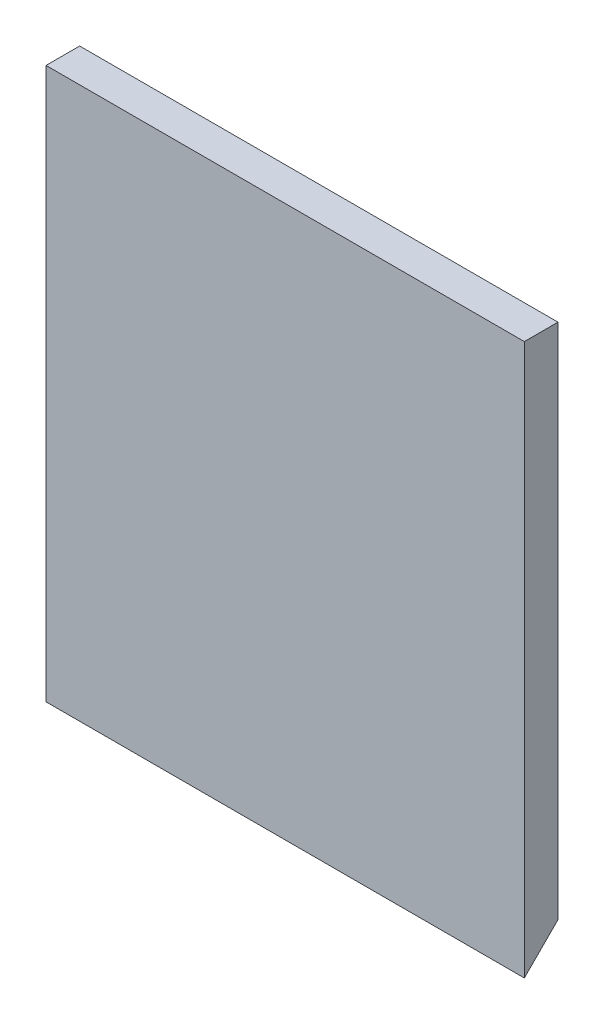
ISO-10303-21;
HEADER;
FILE_DESCRIPTION(('STEP AP214'),'2;1');
FILE_NAME('part.step','',(''),(''),'','','');
FILE_SCHEMA(('AUTOMOTIVE_DESIGN { 1 0 10303 214 1 1 1 1 }'));
ENDSEC;
DATA;
#1=APPLICATION_CONTEXT('core data for automotive mechanical design processes');
#2=APPLICATION_PROTOCOL_DEFINITION('international standard','automotive_design',2000,#1);
#3=PRODUCT_CONTEXT('',#1,'mechanical');
#4=PRODUCT('Part','Part','',(#3));
#5=PRODUCT_RELATED_PRODUCT_CATEGORY('part','',(#4));
#6=PRODUCT_DEFINITION_FORMATION('','',#4);
#7=PRODUCT_DEFINITION_CONTEXT('part definition',#1,'design');
#8=PRODUCT_DEFINITION('design','',#6,#7);
#9=PRODUCT_DEFINITION_SHAPE('','',#8);
#10=(LENGTH_UNIT() NAMED_UNIT(*) SI_UNIT(.MILLI.,.METRE.));
#11=(NAMED_UNIT(*) PLANE_ANGLE_UNIT() SI_UNIT($,.RADIAN.));
#12=(NAMED_UNIT(*) SI_UNIT($,.STERADIAN.) SOLID_ANGLE_UNIT());
#13=UNCERTAINTY_MEASURE_WITH_UNIT(LENGTH_MEASURE(1.E-05),#10,'distance_accuracy_value','');
#14=(GEOMETRIC_REPRESENTATION_CONTEXT(3) GLOBAL_UNCERTAINTY_ASSIGNED_CONTEXT((#13)) GLOBAL_UNIT_ASSIGNED_CONTEXT((#10,
#11,#12)) REPRESENTATION_CONTEXT('',''));
#15=CARTESIAN_POINT('',(0.,0.,0.));
#16=DIRECTION('',(0.,0.,1.));
#17=DIRECTION('',(1.,0.,0.));
#18=AXIS2_PLACEMENT_3D('',#15,#16,#17);
#19=CARTESIAN_POINT('',(128.,0.,18.));
#20=DIRECTION('',(-1.,0.,0.));
#21=DIRECTION('',(0.,-1.,0.));
#22=AXIS2_PLACEMENT_3D('',#19,#20,#21);
#23=PLANE('',#22);
#24=DIRECTION('',(0.,1.,0.));
#25=VECTOR('',#24,1.);
#26=CARTESIAN_POINT('',(128.,0.,18.));
#27=LINE('',#26,#25);
#28=CARTESIAN_POINT('',(128.,0.,18.));
#29=VERTEX_POINT('',#28);
#30=CARTESIAN_POINT('',(128.,295.,18.));
#31=VERTEX_POINT('',#30);
#32=EDGE_CURVE('E85',#29,#31,#27,.T.);
#33=ORIENTED_EDGE('',*,*,#32,.F.);
#34=DIRECTION('',(0.,0.707106781186551,-0.707106781186544));
#35=VECTOR('',#34,1.);
#36=CARTESIAN_POINT('',(128.,0.,18.));
#37=LINE('',#36,#35);
#38=CARTESIAN_POINT('',(128.,18.0000000000002,0.));
#39=VERTEX_POINT('',#38);
#40=EDGE_CURVE('E90',#29,#39,#37,.T.);
#41=ORIENTED_EDGE('',*,*,#40,.T.);
#42=DIRECTION('',(0.,1.,0.));
#43=VECTOR('',#42,1.);
#44=CARTESIAN_POINT('',(128.,0.,0.));
#45=LINE('',#44,#43);
#46=CARTESIAN_POINT('',(128.,295.,0.));
#47=VERTEX_POINT('',#46);
#48=EDGE_CURVE('E76',#39,#47,#45,.T.);
#49=ORIENTED_EDGE('',*,*,#48,.T.);
#50=DIRECTION('',(0.,0.,-1.));
#51=VECTOR('',#50,1.);
#52=CARTESIAN_POINT('',(128.,295.,18.));
#53=LINE('',#52,#51);
#54=EDGE_CURVE('E11',#31,#47,#53,.T.);
#55=ORIENTED_EDGE('',*,*,#54,.F.);
#56=EDGE_LOOP('',(#33,#41,#49,#55));
#57=FACE_BOUND('',#56,.T.);
#58=ADVANCED_FACE('F32',(#57),#23,.F.);
#59=CARTESIAN_POINT('',(128.,295.,18.));
#60=DIRECTION('',(0.,-1.,0.));
#61=DIRECTION('',(0.,0.,-1.));
#62=AXIS2_PLACEMENT_3D('',#59,#60,#61);
#63=PLANE('',#62);
#64=DIRECTION('',(-1.,0.,0.));
#65=VECTOR('',#64,1.);
#66=CARTESIAN_POINT('',(128.,295.,0.));
#67=LINE('',#66,#65);
#68=CARTESIAN_POINT('',(-128.,295.,0.));
#69=VERTEX_POINT('',#68);
#70=EDGE_CURVE('E67',#47,#69,#67,.T.);
#71=ORIENTED_EDGE('',*,*,#70,.T.);
#72=DIRECTION('',(0.,0.,-1.));
#73=VECTOR('',#72,1.);
#74=CARTESIAN_POINT('',(-128.,295.,18.));
#75=LINE('',#74,#73);
#76=CARTESIAN_POINT('',(-128.,295.,18.));
#77=VERTEX_POINT('',#76);
#78=EDGE_CURVE('E39',#77,#69,#75,.T.);
#79=ORIENTED_EDGE('',*,*,#78,.F.);
#80=DIRECTION('',(-1.,0.,0.));
#81=VECTOR('',#80,1.);
#82=CARTESIAN_POINT('',(128.,295.,18.));
#83=LINE('',#82,#81);
#84=EDGE_CURVE('E55',#31,#77,#83,.T.);
#85=ORIENTED_EDGE('',*,*,#84,.F.);
#86=ORIENTED_EDGE('',*,*,#54,.T.);
#87=EDGE_LOOP('',(#71,#79,#85,#86));
#88=FACE_BOUND('',#87,.T.);
#89=ADVANCED_FACE('F69',(#88),#63,.F.);
#90=CARTESIAN_POINT('',(-128.,0.,18.));
#91=DIRECTION('',(1.,0.,0.));
#92=DIRECTION('',(0.,1.,0.));
#93=AXIS2_PLACEMENT_3D('',#90,#91,#92);
#94=PLANE('',#93);
#95=DIRECTION('',(0.,-1.,0.));
#96=VECTOR('',#95,1.);
#97=CARTESIAN_POINT('',(-128.,0.,0.));
#98=LINE('',#97,#96);
#99=CARTESIAN_POINT('',(-128.,18.0000000000002,0.));
#100=VERTEX_POINT('',#99);
#101=EDGE_CURVE('E75',#69,#100,#98,.T.);
#102=ORIENTED_EDGE('',*,*,#101,.T.);
#103=DIRECTION('',(0.,-0.707106781186552,0.707106781186544));
#104=VECTOR('',#103,1.);
#105=CARTESIAN_POINT('',(-128.,0.,18.));
#106=LINE('',#105,#104);
#107=CARTESIAN_POINT('',(-128.,0.,18.));
#108=VERTEX_POINT('',#107);
#109=EDGE_CURVE('E46',#100,#108,#106,.T.);
#110=ORIENTED_EDGE('',*,*,#109,.T.);
#111=DIRECTION('',(0.,-1.,0.));
#112=VECTOR('',#111,1.);
#113=CARTESIAN_POINT('',(-128.,0.,18.));
#114=LINE('',#113,#112);
#115=EDGE_CURVE('E81',#77,#108,#114,.T.);
#116=ORIENTED_EDGE('',*,*,#115,.F.);
#117=ORIENTED_EDGE('',*,*,#78,.T.);
#118=EDGE_LOOP('',(#102,#110,#116,#117));
#119=FACE_BOUND('',#118,.T.);
#120=ADVANCED_FACE('F80',(#119),#94,.F.);
#121=CARTESIAN_POINT('',(0.,0.,18.));
#122=DIRECTION('',(0.,0.,1.));
#123=DIRECTION('',(1.,0.,0.));
#124=AXIS2_PLACEMENT_3D('',#121,#122,#123);
#125=PLANE('',#124);
#126=ORIENTED_EDGE('',*,*,#32,.T.);
#127=ORIENTED_EDGE('',*,*,#84,.T.);
#128=ORIENTED_EDGE('',*,*,#115,.T.);
#129=DIRECTION('',(1.,0.,0.));
#130=VECTOR('',#129,1.);
#131=CARTESIAN_POINT('',(-128.,0.,18.));
#132=LINE('',#131,#130);
#133=EDGE_CURVE('E82',#108,#29,#132,.T.);
#134=ORIENTED_EDGE('',*,*,#133,.T.);
#135=EDGE_LOOP('',(#126,#127,#128,#134));
#136=FACE_BOUND('',#135,.T.);
#137=ADVANCED_FACE('F101',(#136),#125,.T.);
#138=CARTESIAN_POINT('',(0.,0.,0.));
#139=DIRECTION('',(0.,0.,1.));
#140=DIRECTION('',(1.,0.,0.));
#141=AXIS2_PLACEMENT_3D('',#138,#139,#140);
#142=PLANE('',#141);
#143=ORIENTED_EDGE('',*,*,#48,.F.);
#144=DIRECTION('',(1.,0.,0.));
#145=VECTOR('',#144,1.);
#146=CARTESIAN_POINT('',(-128.,18.0000000000002,0.));
#147=LINE('',#146,#145);
#148=EDGE_CURVE('E84',#100,#39,#147,.T.);
#149=ORIENTED_EDGE('',*,*,#148,.F.);
#150=ORIENTED_EDGE('',*,*,#101,.F.);
#151=ORIENTED_EDGE('',*,*,#70,.F.);
#152=EDGE_LOOP('',(#143,#149,#150,#151));
#153=FACE_BOUND('',#152,.T.);
#154=ADVANCED_FACE('F83',(#153),#142,.F.);
#155=CARTESIAN_POINT('',(-128.,0.,18.));
#156=DIRECTION('',(0.,0.707106781186544,0.707106781186551));
#157=DIRECTION('',(0.,-0.707106781186551,0.707106781186544));
#158=AXIS2_PLACEMENT_3D('',#155,#156,#157);
#159=PLANE('',#158);
#160=ORIENTED_EDGE('',*,*,#133,.F.);
#161=ORIENTED_EDGE('',*,*,#109,.F.);
#162=ORIENTED_EDGE('',*,*,#148,.T.);
#163=ORIENTED_EDGE('',*,*,#40,.F.);
#164=EDGE_LOOP('',(#160,#161,#162,#163));
#165=FACE_BOUND('',#164,.T.);
#166=ADVANCED_FACE('F106',(#165),#159,.F.);
#167=CLOSED_SHELL('',(#58,#89,#120,#137,#154,#166));
#168=MANIFOLD_SOLID_BREP('B2',#167);
#169=ADVANCED_BREP_SHAPE_REPRESENTATION('',(#18,#168),#14);
#170=SHAPE_DEFINITION_REPRESENTATION(#9,#169);
ENDSEC;
END-ISO-10303-21;
